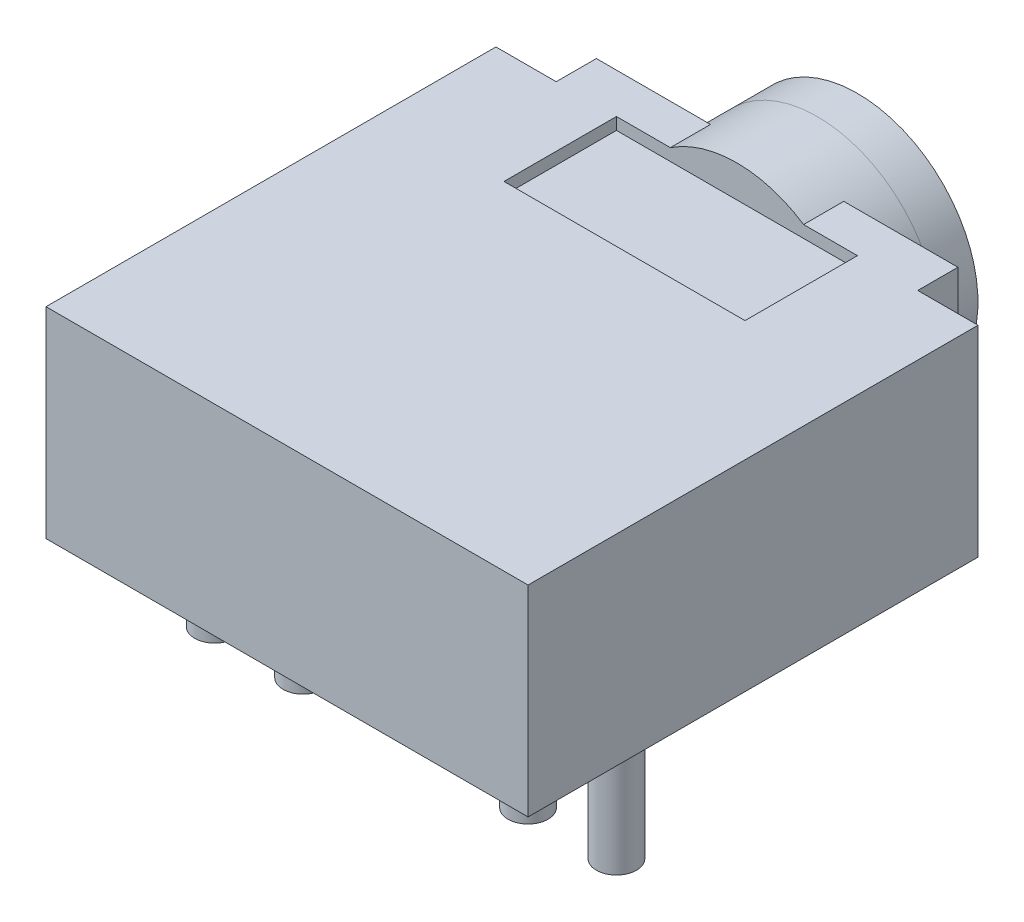
ISO-10303-21;
HEADER;
FILE_DESCRIPTION(('STEP AP214'),'2;1');
FILE_NAME('part.step','',(''),(''),'','','');
FILE_SCHEMA(('AUTOMOTIVE_DESIGN { 1 0 10303 214 1 1 1 1 }'));
ENDSEC;
DATA;
#1=APPLICATION_CONTEXT('core data for automotive mechanical design processes');
#2=APPLICATION_PROTOCOL_DEFINITION('international standard','automotive_design',2000,#1);
#3=PRODUCT_CONTEXT('',#1,'mechanical');
#4=PRODUCT('Part','Part','',(#3));
#5=PRODUCT_RELATED_PRODUCT_CATEGORY('part','',(#4));
#6=PRODUCT_DEFINITION_FORMATION('','',#4);
#7=PRODUCT_DEFINITION_CONTEXT('part definition',#1,'design');
#8=PRODUCT_DEFINITION('design','',#6,#7);
#9=PRODUCT_DEFINITION_SHAPE('','',#8);
#10=(LENGTH_UNIT() NAMED_UNIT(*) SI_UNIT(.MILLI.,.METRE.));
#11=(NAMED_UNIT(*) PLANE_ANGLE_UNIT() SI_UNIT($,.RADIAN.));
#12=(NAMED_UNIT(*) SI_UNIT($,.STERADIAN.) SOLID_ANGLE_UNIT());
#13=UNCERTAINTY_MEASURE_WITH_UNIT(LENGTH_MEASURE(1.E-05),#10,'distance_accuracy_value','');
#14=(GEOMETRIC_REPRESENTATION_CONTEXT(3) GLOBAL_UNCERTAINTY_ASSIGNED_CONTEXT((#13)) GLOBAL_UNIT_ASSIGNED_CONTEXT((#10,
#11,#12)) REPRESENTATION_CONTEXT('',''));
#15=CARTESIAN_POINT('',(0.,0.,0.));
#16=DIRECTION('',(0.,0.,1.));
#17=DIRECTION('',(1.,0.,0.));
#18=AXIS2_PLACEMENT_3D('',#15,#16,#17);
#19=CARTESIAN_POINT('',(-4.5,0.,-11.2));
#20=DIRECTION('',(0.,-1.,0.));
#21=DIRECTION('',(0.,0.,-1.));
#22=AXIS2_PLACEMENT_3D('',#19,#20,#21);
#23=PLANE('',#22);
#24=CARTESIAN_POINT('',(5.,0.,-3.2));
#25=DIRECTION('',(0.,-1.,0.));
#26=DIRECTION('',(0.,0.,1.));
#27=AXIS2_PLACEMENT_3D('',#24,#25,#26);
#28=CIRCLE('',#27,0.500000000000001);
#29=CARTESIAN_POINT('',(5.,0.,-2.7));
#30=VERTEX_POINT('',#29);
#31=EDGE_CURVE('E639',#30,#30,#28,.T.);
#32=ORIENTED_EDGE('',*,*,#31,.F.);
#33=EDGE_LOOP('',(#32));
#34=FACE_BOUND('',#33,.T.);
#35=CARTESIAN_POINT('',(-2.8,0.,-3.2));
#36=DIRECTION('',(0.,-1.,0.));
#37=DIRECTION('',(0.,0.,-1.));
#38=AXIS2_PLACEMENT_3D('',#35,#36,#37);
#39=CIRCLE('',#38,0.5);
#40=CARTESIAN_POINT('',(-2.8,0.,-3.7));
#41=VERTEX_POINT('',#40);
#42=EDGE_CURVE('E656',#41,#41,#39,.T.);
#43=ORIENTED_EDGE('',*,*,#42,.F.);
#44=EDGE_LOOP('',(#43));
#45=FACE_BOUND('',#44,.T.);
#46=DIRECTION('',(1.,0.,0.));
#47=VECTOR('',#46,1.);
#48=CARTESIAN_POINT('',(-4.5,0.,-11.2));
#49=LINE('',#48,#47);
#50=CARTESIAN_POINT('',(-1.6583123951777,0.,-11.2));
#51=VERTEX_POINT('',#50);
#52=CARTESIAN_POINT('',(1.6583123951777,0.,-11.2));
#53=VERTEX_POINT('',#52);
#54=EDGE_CURVE('E260',#51,#53,#49,.T.);
#55=ORIENTED_EDGE('',*,*,#54,.T.);
#56=DIRECTION('',(0.,0.,1.));
#57=VECTOR('',#56,1.);
#58=CARTESIAN_POINT('',(1.6583123951777,0.,-13.2));
#59=LINE('',#58,#57);
#60=CARTESIAN_POINT('',(1.6583123951777,0.,-12.2));
#61=VERTEX_POINT('',#60);
#62=EDGE_CURVE('E159',#53,#61,#59,.F.);
#63=ORIENTED_EDGE('',*,*,#62,.T.);
#64=DIRECTION('',(-1.,0.,0.));
#65=VECTOR('',#64,1.);
#66=CARTESIAN_POINT('',(4.5,0.,-12.2));
#67=LINE('',#66,#65);
#68=CARTESIAN_POINT('',(4.5,0.,-12.2));
#69=VERTEX_POINT('',#68);
#70=EDGE_CURVE('E214',#69,#61,#67,.T.);
#71=ORIENTED_EDGE('',*,*,#70,.F.);
#72=DIRECTION('',(0.,0.,-1.));
#73=VECTOR('',#72,1.);
#74=CARTESIAN_POINT('',(4.5,0.,-12.2));
#75=LINE('',#74,#73);
#76=CARTESIAN_POINT('',(4.5,0.,-11.2));
#77=VERTEX_POINT('',#76);
#78=EDGE_CURVE('E211',#77,#69,#75,.T.);
#79=ORIENTED_EDGE('',*,*,#78,.F.);
#80=DIRECTION('',(-1.,0.,0.));
#81=VECTOR('',#80,1.);
#82=CARTESIAN_POINT('',(4.5,0.,-11.2));
#83=LINE('',#82,#81);
#84=CARTESIAN_POINT('',(6.,0.,-11.2));
#85=VERTEX_POINT('',#84);
#86=EDGE_CURVE('E209',#85,#77,#83,.T.);
#87=ORIENTED_EDGE('',*,*,#86,.F.);
#88=DIRECTION('',(0.,0.,-1.));
#89=VECTOR('',#88,1.);
#90=CARTESIAN_POINT('',(6.,0.,-11.2));
#91=LINE('',#90,#89);
#92=CARTESIAN_POINT('',(6.,0.,0.));
#93=VERTEX_POINT('',#92);
#94=EDGE_CURVE('E207',#93,#85,#91,.T.);
#95=ORIENTED_EDGE('',*,*,#94,.F.);
#96=DIRECTION('',(1.,0.,0.));
#97=VECTOR('',#96,1.);
#98=CARTESIAN_POINT('',(-6.,0.,0.));
#99=LINE('',#98,#97);
#100=CARTESIAN_POINT('',(-6.,0.,0.));
#101=VERTEX_POINT('',#100);
#102=EDGE_CURVE('E205',#101,#93,#99,.T.);
#103=ORIENTED_EDGE('',*,*,#102,.F.);
#104=DIRECTION('',(0.,0.,1.));
#105=VECTOR('',#104,1.);
#106=CARTESIAN_POINT('',(-6.,0.,-11.2));
#107=LINE('',#106,#105);
#108=CARTESIAN_POINT('',(-6.,0.,-11.2));
#109=VERTEX_POINT('',#108);
#110=EDGE_CURVE('E203',#109,#101,#107,.T.);
#111=ORIENTED_EDGE('',*,*,#110,.F.);
#112=DIRECTION('',(-1.,0.,0.));
#113=VECTOR('',#112,1.);
#114=CARTESIAN_POINT('',(-4.5,0.,-11.2));
#115=LINE('',#114,#113);
#116=CARTESIAN_POINT('',(-4.5,0.,-11.2));
#117=VERTEX_POINT('',#116);
#118=EDGE_CURVE('E201',#117,#109,#115,.T.);
#119=ORIENTED_EDGE('',*,*,#118,.F.);
#120=DIRECTION('',(0.,0.,1.));
#121=VECTOR('',#120,1.);
#122=CARTESIAN_POINT('',(-4.5,0.,-12.2));
#123=LINE('',#122,#121);
#124=CARTESIAN_POINT('',(-4.5,0.,-12.2));
#125=VERTEX_POINT('',#124);
#126=EDGE_CURVE('E193',#125,#117,#123,.T.);
#127=ORIENTED_EDGE('',*,*,#126,.F.);
#128=CARTESIAN_POINT('',(-1.6583123951777,0.,-12.2));
#129=VERTEX_POINT('',#128);
#130=EDGE_CURVE('E213',#129,#125,#67,.T.);
#131=ORIENTED_EDGE('',*,*,#130,.F.);
#132=DIRECTION('',(0.,0.,1.));
#133=VECTOR('',#132,1.);
#134=CARTESIAN_POINT('',(-1.6583123951777,0.,-13.2));
#135=LINE('',#134,#133);
#136=EDGE_CURVE('E262',#129,#51,#135,.T.);
#137=ORIENTED_EDGE('',*,*,#136,.T.);
#138=EDGE_LOOP('',(#55,#63,#71,#79,#87,#95,#103,#111,#119,#127,#131,#137));
#139=FACE_BOUND('',#138,.T.);
#140=CARTESIAN_POINT('',(-5.,0.,-3.2));
#141=DIRECTION('',(0.,-1.,0.));
#142=DIRECTION('',(0.,0.,-1.));
#143=AXIS2_PLACEMENT_3D('',#140,#141,#142);
#144=CIRCLE('',#143,0.500000000000001);
#145=CARTESIAN_POINT('',(-5.,0.,-3.7));
#146=VERTEX_POINT('',#145);
#147=EDGE_CURVE('E662',#146,#146,#144,.T.);
#148=ORIENTED_EDGE('',*,*,#147,.F.);
#149=EDGE_LOOP('',(#148));
#150=FACE_BOUND('',#149,.T.);
#151=CARTESIAN_POINT('',(0.,0.,-8.4));
#152=DIRECTION('',(0.,-1.,0.));
#153=DIRECTION('',(0.,0.,-1.));
#154=AXIS2_PLACEMENT_3D('',#151,#152,#153);
#155=CIRCLE('',#154,0.5);
#156=CARTESIAN_POINT('',(0.,0.,-8.9));
#157=VERTEX_POINT('',#156);
#158=EDGE_CURVE('E650',#157,#157,#155,.T.);
#159=ORIENTED_EDGE('',*,*,#158,.F.);
#160=EDGE_LOOP('',(#159));
#161=FACE_BOUND('',#160,.T.);
#162=CARTESIAN_POINT('',(2.8,0.,-3.2));
#163=DIRECTION('',(0.,-1.,0.));
#164=DIRECTION('',(0.,0.,1.));
#165=AXIS2_PLACEMENT_3D('',#162,#163,#164);
#166=CIRCLE('',#165,0.5);
#167=CARTESIAN_POINT('',(2.8,0.,-2.7));
#168=VERTEX_POINT('',#167);
#169=EDGE_CURVE('E640',#168,#168,#166,.T.);
#170=ORIENTED_EDGE('',*,*,#169,.F.);
#171=EDGE_LOOP('',(#170));
#172=FACE_BOUND('',#171,.T.);
#173=ADVANCED_FACE('F32',(#34,#45,#139,#150,#161,#172),#23,.T.);
#174=CARTESIAN_POINT('',(4.5,5.,-12.2));
#175=DIRECTION('',(0.,0.,1.));
#176=DIRECTION('',(1.,0.,0.));
#177=AXIS2_PLACEMENT_3D('',#174,#175,#176);
#178=PLANE('',#177);
#179=CARTESIAN_POINT('',(0.,2.5,-12.2));
#180=DIRECTION('',(0.,0.,1.));
#181=DIRECTION('',(1.,0.,0.));
#182=AXIS2_PLACEMENT_3D('',#179,#180,#181);
#183=CIRCLE('',#182,3.);
#184=CARTESIAN_POINT('',(-1.6583123951777,5.,-12.2));
#185=VERTEX_POINT('',#184);
#186=EDGE_CURVE('E155',#129,#185,#183,.F.);
#187=ORIENTED_EDGE('',*,*,#186,.F.);
#188=ORIENTED_EDGE('',*,*,#130,.T.);
#189=DIRECTION('',(0.,-1.,0.));
#190=VECTOR('',#189,1.);
#191=CARTESIAN_POINT('',(-4.5,5.,-12.2));
#192=LINE('',#191,#190);
#193=CARTESIAN_POINT('',(-4.5,5.,-12.2));
#194=VERTEX_POINT('',#193);
#195=EDGE_CURVE('E236',#194,#125,#192,.T.);
#196=ORIENTED_EDGE('',*,*,#195,.F.);
#197=DIRECTION('',(-1.,0.,0.));
#198=VECTOR('',#197,1.);
#199=CARTESIAN_POINT('',(4.5,5.,-12.2));
#200=LINE('',#199,#198);
#201=EDGE_CURVE('E232',#185,#194,#200,.T.);
#202=ORIENTED_EDGE('',*,*,#201,.F.);
#203=EDGE_LOOP('',(#187,#188,#196,#202));
#204=FACE_BOUND('',#203,.T.);
#205=ADVANCED_FACE('F302',(#204),#178,.F.);
#206=CARTESIAN_POINT('',(1.6583123951777,5.,-12.2));
#207=VERTEX_POINT('',#206);
#208=EDGE_CURVE('E270',#207,#61,#183,.F.);
#209=ORIENTED_EDGE('',*,*,#208,.F.);
#210=CARTESIAN_POINT('',(4.5,5.,-12.2));
#211=VERTEX_POINT('',#210);
#212=EDGE_CURVE('E233',#211,#207,#200,.T.);
#213=ORIENTED_EDGE('',*,*,#212,.F.);
#214=DIRECTION('',(0.,-1.,0.));
#215=VECTOR('',#214,1.);
#216=CARTESIAN_POINT('',(4.5,5.,-12.2));
#217=LINE('',#216,#215);
#218=EDGE_CURVE('E239',#211,#69,#217,.T.);
#219=ORIENTED_EDGE('',*,*,#218,.T.);
#220=ORIENTED_EDGE('',*,*,#70,.T.);
#221=EDGE_LOOP('',(#209,#213,#219,#220));
#222=FACE_BOUND('',#221,.T.);
#223=ADVANCED_FACE('F307',(#222),#178,.F.);
#224=CARTESIAN_POINT('',(-4.5,5.,-11.2));
#225=DIRECTION('',(0.,-1.,0.));
#226=DIRECTION('',(0.,0.,-1.));
#227=AXIS2_PLACEMENT_3D('',#224,#225,#226);
#228=PLANE('',#227);
#229=DIRECTION('',(0.,0.,1.));
#230=VECTOR('',#229,1.);
#231=CARTESIAN_POINT('',(1.6583123951777,5.,-13.2));
#232=LINE('',#231,#230);
#233=CARTESIAN_POINT('',(1.6583123951777,5.,-11.2));
#234=VERTEX_POINT('',#233);
#235=EDGE_CURVE('E273',#234,#207,#232,.F.);
#236=ORIENTED_EDGE('',*,*,#235,.F.);
#237=DIRECTION('',(-1.,0.,0.));
#238=VECTOR('',#237,1.);
#239=CARTESIAN_POINT('',(-3.,5.,-11.2));
#240=LINE('',#239,#238);
#241=CARTESIAN_POINT('',(3.,5.,-11.2));
#242=VERTEX_POINT('',#241);
#243=EDGE_CURVE('E167',#242,#234,#240,.T.);
#244=ORIENTED_EDGE('',*,*,#243,.F.);
#245=DIRECTION('',(0.,0.,-1.));
#246=VECTOR('',#245,1.);
#247=CARTESIAN_POINT('',(3.,5.,-11.2));
#248=LINE('',#247,#246);
#249=CARTESIAN_POINT('',(3.,5.,-8.4));
#250=VERTEX_POINT('',#249);
#251=EDGE_CURVE('E172',#250,#242,#248,.T.);
#252=ORIENTED_EDGE('',*,*,#251,.F.);
#253=DIRECTION('',(1.,0.,0.));
#254=VECTOR('',#253,1.);
#255=CARTESIAN_POINT('',(-3.,5.,-8.4));
#256=LINE('',#255,#254);
#257=CARTESIAN_POINT('',(-3.,5.,-8.4));
#258=VERTEX_POINT('',#257);
#259=EDGE_CURVE('E176',#258,#250,#256,.T.);
#260=ORIENTED_EDGE('',*,*,#259,.F.);
#261=DIRECTION('',(0.,0.,1.));
#262=VECTOR('',#261,1.);
#263=CARTESIAN_POINT('',(-3.,5.,-11.2));
#264=LINE('',#263,#262);
#265=CARTESIAN_POINT('',(-3.,5.,-11.2));
#266=VERTEX_POINT('',#265);
#267=EDGE_CURVE('E58',#266,#258,#264,.T.);
#268=ORIENTED_EDGE('',*,*,#267,.F.);
#269=CARTESIAN_POINT('',(-1.6583123951777,5.,-11.2));
#270=VERTEX_POINT('',#269);
#271=EDGE_CURVE('E165',#270,#266,#240,.T.);
#272=ORIENTED_EDGE('',*,*,#271,.F.);
#273=DIRECTION('',(0.,0.,1.));
#274=VECTOR('',#273,1.);
#275=CARTESIAN_POINT('',(-1.6583123951777,5.,-13.2));
#276=LINE('',#275,#274);
#277=EDGE_CURVE('E149',#185,#270,#276,.T.);
#278=ORIENTED_EDGE('',*,*,#277,.F.);
#279=ORIENTED_EDGE('',*,*,#201,.T.);
#280=DIRECTION('',(0.,0.,1.));
#281=VECTOR('',#280,1.);
#282=CARTESIAN_POINT('',(-4.5,5.,-12.2));
#283=LINE('',#282,#281);
#284=CARTESIAN_POINT('',(-4.5,5.,-11.2));
#285=VERTEX_POINT('',#284);
#286=EDGE_CURVE('E217',#194,#285,#283,.T.);
#287=ORIENTED_EDGE('',*,*,#286,.T.);
#288=DIRECTION('',(-1.,0.,0.));
#289=VECTOR('',#288,1.);
#290=CARTESIAN_POINT('',(-4.5,5.,-11.2));
#291=LINE('',#290,#289);
#292=CARTESIAN_POINT('',(-6.,5.,-11.2));
#293=VERTEX_POINT('',#292);
#294=EDGE_CURVE('E220',#285,#293,#291,.T.);
#295=ORIENTED_EDGE('',*,*,#294,.T.);
#296=DIRECTION('',(0.,0.,1.));
#297=VECTOR('',#296,1.);
#298=CARTESIAN_POINT('',(-6.,5.,-11.2));
#299=LINE('',#298,#297);
#300=CARTESIAN_POINT('',(-6.,5.,0.));
#301=VERTEX_POINT('',#300);
#302=EDGE_CURVE('E222',#293,#301,#299,.T.);
#303=ORIENTED_EDGE('',*,*,#302,.T.);
#304=DIRECTION('',(1.,0.,0.));
#305=VECTOR('',#304,1.);
#306=CARTESIAN_POINT('',(-6.,5.,0.));
#307=LINE('',#306,#305);
#308=CARTESIAN_POINT('',(6.,5.,0.));
#309=VERTEX_POINT('',#308);
#310=EDGE_CURVE('E224',#301,#309,#307,.T.);
#311=ORIENTED_EDGE('',*,*,#310,.T.);
#312=DIRECTION('',(0.,0.,-1.));
#313=VECTOR('',#312,1.);
#314=CARTESIAN_POINT('',(6.,5.,-11.2));
#315=LINE('',#314,#313);
#316=CARTESIAN_POINT('',(6.,5.,-11.2));
#317=VERTEX_POINT('',#316);
#318=EDGE_CURVE('E226',#309,#317,#315,.T.);
#319=ORIENTED_EDGE('',*,*,#318,.T.);
#320=DIRECTION('',(-1.,0.,0.));
#321=VECTOR('',#320,1.);
#322=CARTESIAN_POINT('',(4.5,5.,-11.2));
#323=LINE('',#322,#321);
#324=CARTESIAN_POINT('',(4.5,5.,-11.2));
#325=VERTEX_POINT('',#324);
#326=EDGE_CURVE('E228',#317,#325,#323,.T.);
#327=ORIENTED_EDGE('',*,*,#326,.T.);
#328=DIRECTION('',(0.,0.,-1.));
#329=VECTOR('',#328,1.);
#330=CARTESIAN_POINT('',(4.5,5.,-12.2));
#331=LINE('',#330,#329);
#332=EDGE_CURVE('E230',#325,#211,#331,.T.);
#333=ORIENTED_EDGE('',*,*,#332,.T.);
#334=ORIENTED_EDGE('',*,*,#212,.T.);
#335=EDGE_LOOP('',(#236,#244,#252,#260,#268,#272,#278,#279,#287,#295,#303,#311,#319,#327,#333,#334));
#336=FACE_BOUND('',#335,.T.);
#337=ADVANCED_FACE('F170',(#336),#228,.F.);
#338=CARTESIAN_POINT('',(-4.5,5.,-12.2));
#339=DIRECTION('',(1.,0.,0.));
#340=DIRECTION('',(0.,0.,-1.));
#341=AXIS2_PLACEMENT_3D('',#338,#339,#340);
#342=PLANE('',#341);
#343=ORIENTED_EDGE('',*,*,#126,.T.);
#344=DIRECTION('',(0.,-1.,0.));
#345=VECTOR('',#344,1.);
#346=CARTESIAN_POINT('',(-4.5,5.,-11.2));
#347=LINE('',#346,#345);
#348=EDGE_CURVE('E11',#285,#117,#347,.T.);
#349=ORIENTED_EDGE('',*,*,#348,.F.);
#350=ORIENTED_EDGE('',*,*,#286,.F.);
#351=ORIENTED_EDGE('',*,*,#195,.T.);
#352=EDGE_LOOP('',(#343,#349,#350,#351));
#353=FACE_BOUND('',#352,.T.);
#354=ADVANCED_FACE('F34',(#353),#342,.F.);
#355=CARTESIAN_POINT('',(-4.5,5.,-11.2));
#356=DIRECTION('',(0.,0.,1.));
#357=DIRECTION('',(1.,0.,0.));
#358=AXIS2_PLACEMENT_3D('',#355,#356,#357);
#359=PLANE('',#358);
#360=ORIENTED_EDGE('',*,*,#118,.T.);
#361=DIRECTION('',(0.,-1.,0.));
#362=VECTOR('',#361,1.);
#363=CARTESIAN_POINT('',(-6.,5.,-11.2));
#364=LINE('',#363,#362);
#365=EDGE_CURVE('E43',#293,#109,#364,.T.);
#366=ORIENTED_EDGE('',*,*,#365,.F.);
#367=ORIENTED_EDGE('',*,*,#294,.F.);
#368=ORIENTED_EDGE('',*,*,#348,.T.);
#369=EDGE_LOOP('',(#360,#366,#367,#368));
#370=FACE_BOUND('',#369,.T.);
#371=ADVANCED_FACE('F328',(#370),#359,.F.);
#372=CARTESIAN_POINT('',(-6.,5.,-11.2));
#373=DIRECTION('',(1.,0.,0.));
#374=DIRECTION('',(0.,0.,-1.));
#375=AXIS2_PLACEMENT_3D('',#372,#373,#374);
#376=PLANE('',#375);
#377=ORIENTED_EDGE('',*,*,#110,.T.);
#378=DIRECTION('',(0.,-1.,0.));
#379=VECTOR('',#378,1.);
#380=CARTESIAN_POINT('',(-6.,5.,0.));
#381=LINE('',#380,#379);
#382=EDGE_CURVE('E251',#301,#101,#381,.T.);
#383=ORIENTED_EDGE('',*,*,#382,.F.);
#384=ORIENTED_EDGE('',*,*,#302,.F.);
#385=ORIENTED_EDGE('',*,*,#365,.T.);
#386=EDGE_LOOP('',(#377,#383,#384,#385));
#387=FACE_BOUND('',#386,.T.);
#388=ADVANCED_FACE('F325',(#387),#376,.F.);
#389=CARTESIAN_POINT('',(-6.,5.,0.));
#390=DIRECTION('',(0.,0.,-1.));
#391=DIRECTION('',(-1.,0.,0.));
#392=AXIS2_PLACEMENT_3D('',#389,#390,#391);
#393=PLANE('',#392);
#394=ORIENTED_EDGE('',*,*,#102,.T.);
#395=DIRECTION('',(0.,-1.,0.));
#396=VECTOR('',#395,1.);
#397=CARTESIAN_POINT('',(6.,5.,0.));
#398=LINE('',#397,#396);
#399=EDGE_CURVE('E248',#309,#93,#398,.T.);
#400=ORIENTED_EDGE('',*,*,#399,.F.);
#401=ORIENTED_EDGE('',*,*,#310,.F.);
#402=ORIENTED_EDGE('',*,*,#382,.T.);
#403=EDGE_LOOP('',(#394,#400,#401,#402));
#404=FACE_BOUND('',#403,.T.);
#405=ADVANCED_FACE('F321',(#404),#393,.F.);
#406=CARTESIAN_POINT('',(6.,5.,-11.2));
#407=DIRECTION('',(-1.,0.,0.));
#408=DIRECTION('',(0.,0.,1.));
#409=AXIS2_PLACEMENT_3D('',#406,#407,#408);
#410=PLANE('',#409);
#411=ORIENTED_EDGE('',*,*,#94,.T.);
#412=DIRECTION('',(0.,-1.,0.));
#413=VECTOR('',#412,1.);
#414=CARTESIAN_POINT('',(6.,5.,-11.2));
#415=LINE('',#414,#413);
#416=EDGE_CURVE('E245',#317,#85,#415,.T.);
#417=ORIENTED_EDGE('',*,*,#416,.F.);
#418=ORIENTED_EDGE('',*,*,#318,.F.);
#419=ORIENTED_EDGE('',*,*,#399,.T.);
#420=EDGE_LOOP('',(#411,#417,#418,#419));
#421=FACE_BOUND('',#420,.T.);
#422=ADVANCED_FACE('F317',(#421),#410,.F.);
#423=CARTESIAN_POINT('',(4.5,5.,-11.2));
#424=DIRECTION('',(0.,0.,1.));
#425=DIRECTION('',(1.,0.,0.));
#426=AXIS2_PLACEMENT_3D('',#423,#424,#425);
#427=PLANE('',#426);
#428=ORIENTED_EDGE('',*,*,#86,.T.);
#429=DIRECTION('',(0.,-1.,0.));
#430=VECTOR('',#429,1.);
#431=CARTESIAN_POINT('',(4.5,5.,-11.2));
#432=LINE('',#431,#430);
#433=EDGE_CURVE('E242',#325,#77,#432,.T.);
#434=ORIENTED_EDGE('',*,*,#433,.F.);
#435=ORIENTED_EDGE('',*,*,#326,.F.);
#436=ORIENTED_EDGE('',*,*,#416,.T.);
#437=EDGE_LOOP('',(#428,#434,#435,#436));
#438=FACE_BOUND('',#437,.T.);
#439=ADVANCED_FACE('F296',(#438),#427,.F.);
#440=CARTESIAN_POINT('',(4.5,5.,-12.2));
#441=DIRECTION('',(-1.,0.,0.));
#442=DIRECTION('',(0.,0.,1.));
#443=AXIS2_PLACEMENT_3D('',#440,#441,#442);
#444=PLANE('',#443);
#445=ORIENTED_EDGE('',*,*,#78,.T.);
#446=ORIENTED_EDGE('',*,*,#218,.F.);
#447=ORIENTED_EDGE('',*,*,#332,.F.);
#448=ORIENTED_EDGE('',*,*,#433,.T.);
#449=EDGE_LOOP('',(#445,#446,#447,#448));
#450=FACE_BOUND('',#449,.T.);
#451=ADVANCED_FACE('F289',(#450),#444,.F.);
#452=CARTESIAN_POINT('',(-3.,4.7,-11.2));
#453=DIRECTION('',(-1.,0.,0.));
#454=DIRECTION('',(0.,0.,1.));
#455=AXIS2_PLACEMENT_3D('',#452,#453,#454);
#456=PLANE('',#455);
#457=ORIENTED_EDGE('',*,*,#267,.T.);
#458=DIRECTION('',(0.,1.,0.));
#459=VECTOR('',#458,1.);
#460=CARTESIAN_POINT('',(-3.,4.7,-8.4));
#461=LINE('',#460,#459);
#462=CARTESIAN_POINT('',(-3.,4.7,-8.4));
#463=VERTEX_POINT('',#462);
#464=EDGE_CURVE('E190',#463,#258,#461,.T.);
#465=ORIENTED_EDGE('',*,*,#464,.F.);
#466=DIRECTION('',(0.,0.,1.));
#467=VECTOR('',#466,1.);
#468=CARTESIAN_POINT('',(-3.,4.7,-11.2));
#469=LINE('',#468,#467);
#470=CARTESIAN_POINT('',(-3.,4.7,-11.2));
#471=VERTEX_POINT('',#470);
#472=EDGE_CURVE('E174',#471,#463,#469,.T.);
#473=ORIENTED_EDGE('',*,*,#472,.F.);
#474=DIRECTION('',(0.,1.,0.));
#475=VECTOR('',#474,1.);
#476=CARTESIAN_POINT('',(-3.,4.7,-11.2));
#477=LINE('',#476,#475);
#478=EDGE_CURVE('E191',#471,#266,#477,.T.);
#479=ORIENTED_EDGE('',*,*,#478,.T.);
#480=EDGE_LOOP('',(#457,#465,#473,#479));
#481=FACE_BOUND('',#480,.T.);
#482=ADVANCED_FACE('F287',(#481),#456,.F.);
#483=CARTESIAN_POINT('',(-3.,4.7,-11.2));
#484=DIRECTION('',(0.,0.,-1.));
#485=DIRECTION('',(-1.,0.,0.));
#486=AXIS2_PLACEMENT_3D('',#483,#484,#485);
#487=PLANE('',#486);
#488=ORIENTED_EDGE('',*,*,#478,.F.);
#489=DIRECTION('',(-1.,0.,0.));
#490=VECTOR('',#489,1.);
#491=CARTESIAN_POINT('',(-3.,4.7,-11.2));
#492=LINE('',#491,#490);
#493=CARTESIAN_POINT('',(3.,4.7,-11.2));
#494=VERTEX_POINT('',#493);
#495=EDGE_CURVE('E188',#494,#471,#492,.T.);
#496=ORIENTED_EDGE('',*,*,#495,.F.);
#497=DIRECTION('',(0.,1.,0.));
#498=VECTOR('',#497,1.);
#499=CARTESIAN_POINT('',(3.,4.7,-11.2));
#500=LINE('',#499,#498);
#501=EDGE_CURVE('E194',#494,#242,#500,.T.);
#502=ORIENTED_EDGE('',*,*,#501,.T.);
#503=ORIENTED_EDGE('',*,*,#243,.T.);
#504=CARTESIAN_POINT('',(0.,2.5,-11.2));
#505=DIRECTION('',(0.,0.,-1.));
#506=DIRECTION('',(-1.,0.,0.));
#507=AXIS2_PLACEMENT_3D('',#504,#505,#506);
#508=CIRCLE('',#507,3.);
#509=EDGE_CURVE('E152',#270,#234,#508,.T.);
#510=ORIENTED_EDGE('',*,*,#509,.F.);
#511=ORIENTED_EDGE('',*,*,#271,.T.);
#512=EDGE_LOOP('',(#488,#496,#502,#503,#510,#511));
#513=FACE_BOUND('',#512,.T.);
#514=ADVANCED_FACE('F164',(#513),#487,.F.);
#515=CARTESIAN_POINT('',(3.,4.7,-11.2));
#516=DIRECTION('',(1.,0.,0.));
#517=DIRECTION('',(0.,0.,-1.));
#518=AXIS2_PLACEMENT_3D('',#515,#516,#517);
#519=PLANE('',#518);
#520=ORIENTED_EDGE('',*,*,#251,.T.);
#521=ORIENTED_EDGE('',*,*,#501,.F.);
#522=DIRECTION('',(0.,0.,-1.));
#523=VECTOR('',#522,1.);
#524=CARTESIAN_POINT('',(3.,4.7,-11.2));
#525=LINE('',#524,#523);
#526=CARTESIAN_POINT('',(3.,4.7,-8.4));
#527=VERTEX_POINT('',#526);
#528=EDGE_CURVE('E185',#527,#494,#525,.T.);
#529=ORIENTED_EDGE('',*,*,#528,.F.);
#530=DIRECTION('',(0.,1.,0.));
#531=VECTOR('',#530,1.);
#532=CARTESIAN_POINT('',(3.,4.7,-8.4));
#533=LINE('',#532,#531);
#534=EDGE_CURVE('E196',#527,#250,#533,.T.);
#535=ORIENTED_EDGE('',*,*,#534,.T.);
#536=EDGE_LOOP('',(#520,#521,#529,#535));
#537=FACE_BOUND('',#536,.T.);
#538=ADVANCED_FACE('F282',(#537),#519,.F.);
#539=CARTESIAN_POINT('',(-3.,4.7,-8.4));
#540=DIRECTION('',(0.,0.,1.));
#541=DIRECTION('',(1.,0.,0.));
#542=AXIS2_PLACEMENT_3D('',#539,#540,#541);
#543=PLANE('',#542);
#544=ORIENTED_EDGE('',*,*,#259,.T.);
#545=ORIENTED_EDGE('',*,*,#534,.F.);
#546=DIRECTION('',(1.,0.,0.));
#547=VECTOR('',#546,1.);
#548=CARTESIAN_POINT('',(-3.,4.7,-8.4));
#549=LINE('',#548,#547);
#550=EDGE_CURVE('E182',#463,#527,#549,.T.);
#551=ORIENTED_EDGE('',*,*,#550,.F.);
#552=ORIENTED_EDGE('',*,*,#464,.T.);
#553=EDGE_LOOP('',(#544,#545,#551,#552));
#554=FACE_BOUND('',#553,.T.);
#555=ADVANCED_FACE('F278',(#554),#543,.F.);
#556=CARTESIAN_POINT('',(-3.,4.7,-8.4));
#557=DIRECTION('',(0.,1.,0.));
#558=DIRECTION('',(0.,0.,1.));
#559=AXIS2_PLACEMENT_3D('',#556,#557,#558);
#560=PLANE('',#559);
#561=ORIENTED_EDGE('',*,*,#472,.T.);
#562=ORIENTED_EDGE('',*,*,#550,.T.);
#563=ORIENTED_EDGE('',*,*,#528,.T.);
#564=ORIENTED_EDGE('',*,*,#495,.T.);
#565=EDGE_LOOP('',(#561,#562,#563,#564));
#566=FACE_BOUND('',#565,.T.);
#567=ADVANCED_FACE('F285',(#566),#560,.T.);
#568=CARTESIAN_POINT('',(0.,2.5,-13.2));
#569=DIRECTION('',(0.,0.,1.));
#570=DIRECTION('',(1.,0.,0.));
#571=AXIS2_PLACEMENT_3D('',#568,#569,#570);
#572=CYLINDRICAL_SURFACE('',#571,3.);
#573=CARTESIAN_POINT('',(0.,2.5,-13.2));
#574=DIRECTION('',(0.,0.,-1.));
#575=DIRECTION('',(-1.,0.,0.));
#576=AXIS2_PLACEMENT_3D('',#573,#574,#575);
#577=CIRCLE('',#576,2.999);
#578=CARTESIAN_POINT('',(-2.999,2.5,-13.2));
#579=VERTEX_POINT('',#578);
#580=EDGE_CURVE('E168',#579,#579,#577,.T.);
#581=ORIENTED_EDGE('',*,*,#580,.F.);
#582=EDGE_LOOP('',(#581));
#583=FACE_BOUND('',#582,.T.);
#584=ORIENTED_EDGE('',*,*,#509,.T.);
#585=ORIENTED_EDGE('',*,*,#235,.T.);
#586=ORIENTED_EDGE('',*,*,#208,.T.);
#587=ORIENTED_EDGE('',*,*,#62,.F.);
#588=EDGE_CURVE('E50',#53,#51,#508,.T.);
#589=ORIENTED_EDGE('',*,*,#588,.T.);
#590=ORIENTED_EDGE('',*,*,#136,.F.);
#591=ORIENTED_EDGE('',*,*,#186,.T.);
#592=ORIENTED_EDGE('',*,*,#277,.T.);
#593=EDGE_LOOP('',(#584,#585,#586,#587,#589,#590,#591,#592));
#594=FACE_BOUND('',#593,.T.);
#595=ADVANCED_FACE('F151',(#583,#594),#572,.T.);
#596=CARTESIAN_POINT('',(0.,2.5,-11.2));
#597=DIRECTION('',(0.,0.,-1.));
#598=DIRECTION('',(-1.,0.,0.));
#599=AXIS2_PLACEMENT_3D('',#596,#597,#598);
#600=PLANE('',#599);
#601=ORIENTED_EDGE('',*,*,#54,.F.);
#602=ORIENTED_EDGE('',*,*,#588,.F.);
#603=EDGE_LOOP('',(#601,#602));
#604=FACE_BOUND('',#603,.T.);
#605=ADVANCED_FACE('F379',(#604),#600,.F.);
#606=CARTESIAN_POINT('',(0.,2.5,-14.2));
#607=DIRECTION('',(0.,0.,1.));
#608=DIRECTION('',(1.,0.,0.));
#609=AXIS2_PLACEMENT_3D('',#606,#607,#608);
#610=CYLINDRICAL_SURFACE('',#609,2.999);
#611=CARTESIAN_POINT('',(0.,2.5,-14.2));
#612=DIRECTION('',(0.,0.,-1.));
#613=DIRECTION('',(-1.,0.,0.));
#614=AXIS2_PLACEMENT_3D('',#611,#612,#613);
#615=CIRCLE('',#614,2.999);
#616=CARTESIAN_POINT('',(-2.999,2.5,-14.2));
#617=VERTEX_POINT('',#616);
#618=EDGE_CURVE('E355',#617,#617,#615,.T.);
#619=ORIENTED_EDGE('',*,*,#618,.F.);
#620=EDGE_LOOP('',(#619));
#621=FACE_BOUND('',#620,.T.);
#622=ORIENTED_EDGE('',*,*,#580,.T.);
#623=EDGE_LOOP('',(#622));
#624=FACE_BOUND('',#623,.T.);
#625=ADVANCED_FACE('F368',(#621,#624),#610,.T.);
#626=CARTESIAN_POINT('',(0.,2.5,-14.2));
#627=DIRECTION('',(0.,0.,-1.));
#628=DIRECTION('',(-1.,0.,0.));
#629=AXIS2_PLACEMENT_3D('',#626,#627,#628);
#630=PLANE('',#629);
#631=CARTESIAN_POINT('',(0.,2.5,-14.2));
#632=DIRECTION('',(0.,0.,-1.));
#633=DIRECTION('',(-1.,0.,0.));
#634=AXIS2_PLACEMENT_3D('',#631,#632,#633);
#635=CIRCLE('',#634,1.75);
#636=CARTESIAN_POINT('',(-1.75,2.5,-14.2));
#637=VERTEX_POINT('',#636);
#638=EDGE_CURVE('E362',#637,#637,#635,.T.);
#639=ORIENTED_EDGE('',*,*,#638,.F.);
#640=EDGE_LOOP('',(#639));
#641=FACE_BOUND('',#640,.T.);
#642=ORIENTED_EDGE('',*,*,#618,.T.);
#643=EDGE_LOOP('',(#642));
#644=FACE_BOUND('',#643,.T.);
#645=ADVANCED_FACE('F378',(#641,#644),#630,.T.);
#646=CARTESIAN_POINT('',(0.,2.5,-4.2));
#647=DIRECTION('',(0.,0.,-1.));
#648=DIRECTION('',(-1.,0.,0.));
#649=AXIS2_PLACEMENT_3D('',#646,#647,#648);
#650=CYLINDRICAL_SURFACE('',#649,1.75);
#651=CARTESIAN_POINT('',(0.,2.5,-4.2));
#652=DIRECTION('',(0.,0.,-1.));
#653=DIRECTION('',(-1.,0.,0.));
#654=AXIS2_PLACEMENT_3D('',#651,#652,#653);
#655=CIRCLE('',#654,1.75);
#656=CARTESIAN_POINT('',(-1.75,2.5,-4.2));
#657=VERTEX_POINT('',#656);
#658=EDGE_CURVE('E357',#657,#657,#655,.T.);
#659=ORIENTED_EDGE('',*,*,#658,.F.);
#660=EDGE_LOOP('',(#659));
#661=FACE_BOUND('',#660,.T.);
#662=ORIENTED_EDGE('',*,*,#638,.T.);
#663=EDGE_LOOP('',(#662));
#664=FACE_BOUND('',#663,.T.);
#665=ADVANCED_FACE('F418',(#661,#664),#650,.F.);
#666=CARTESIAN_POINT('',(0.,2.5,-4.2));
#667=DIRECTION('',(0.,0.,-1.));
#668=DIRECTION('',(-1.,0.,0.));
#669=AXIS2_PLACEMENT_3D('',#666,#667,#668);
#670=PLANE('',#669);
#671=ORIENTED_EDGE('',*,*,#658,.T.);
#672=EDGE_LOOP('',(#671));
#673=FACE_BOUND('',#672,.T.);
#674=ADVANCED_FACE('F425',(#673),#670,.T.);
#675=CARTESIAN_POINT('',(-5.,-3.,-3.2));
#676=DIRECTION('',(0.,1.,0.));
#677=DIRECTION('',(0.,0.,1.));
#678=AXIS2_PLACEMENT_3D('',#675,#676,#677);
#679=CYLINDRICAL_SURFACE('',#678,0.500000000000001);
#680=CARTESIAN_POINT('',(-5.,-3.,-3.2));
#681=DIRECTION('',(0.,-1.,0.));
#682=DIRECTION('',(0.,0.,-1.));
#683=AXIS2_PLACEMENT_3D('',#680,#681,#682);
#684=CIRCLE('',#683,0.500000000000001);
#685=CARTESIAN_POINT('',(-5.,-3.,-3.7));
#686=VERTEX_POINT('',#685);
#687=EDGE_CURVE('E665',#686,#686,#684,.T.);
#688=ORIENTED_EDGE('',*,*,#687,.F.);
#689=EDGE_LOOP('',(#688));
#690=FACE_BOUND('',#689,.T.);
#691=ORIENTED_EDGE('',*,*,#147,.T.);
#692=EDGE_LOOP('',(#691));
#693=FACE_BOUND('',#692,.T.);
#694=ADVANCED_FACE('F432',(#690,#693),#679,.T.);
#695=CARTESIAN_POINT('',(-5.,-3.,-3.2));
#696=DIRECTION('',(0.,-1.,0.));
#697=DIRECTION('',(0.,0.,-1.));
#698=AXIS2_PLACEMENT_3D('',#695,#696,#697);
#699=PLANE('',#698);
#700=ORIENTED_EDGE('',*,*,#687,.T.);
#701=EDGE_LOOP('',(#700));
#702=FACE_BOUND('',#701,.T.);
#703=ADVANCED_FACE('F440',(#702),#699,.T.);
#704=CARTESIAN_POINT('',(-2.8,-3.,-3.2));
#705=DIRECTION('',(0.,1.,0.));
#706=DIRECTION('',(0.,0.,1.));
#707=AXIS2_PLACEMENT_3D('',#704,#705,#706);
#708=CYLINDRICAL_SURFACE('',#707,0.5);
#709=CARTESIAN_POINT('',(-2.8,-3.,-3.2));
#710=DIRECTION('',(0.,-1.,0.));
#711=DIRECTION('',(0.,0.,-1.));
#712=AXIS2_PLACEMENT_3D('',#709,#710,#711);
#713=CIRCLE('',#712,0.5);
#714=CARTESIAN_POINT('',(-2.8,-3.,-3.7));
#715=VERTEX_POINT('',#714);
#716=EDGE_CURVE('E659',#715,#715,#713,.T.);
#717=ORIENTED_EDGE('',*,*,#716,.F.);
#718=EDGE_LOOP('',(#717));
#719=FACE_BOUND('',#718,.T.);
#720=ORIENTED_EDGE('',*,*,#42,.T.);
#721=EDGE_LOOP('',(#720));
#722=FACE_BOUND('',#721,.T.);
#723=ADVANCED_FACE('F448',(#719,#722),#708,.T.);
#724=CARTESIAN_POINT('',(-2.8,-3.,-3.2));
#725=DIRECTION('',(0.,-1.,0.));
#726=DIRECTION('',(0.,0.,-1.));
#727=AXIS2_PLACEMENT_3D('',#724,#725,#726);
#728=PLANE('',#727);
#729=ORIENTED_EDGE('',*,*,#716,.T.);
#730=EDGE_LOOP('',(#729));
#731=FACE_BOUND('',#730,.T.);
#732=ADVANCED_FACE('F456',(#731),#728,.T.);
#733=CARTESIAN_POINT('',(0.,-3.,-8.4));
#734=DIRECTION('',(0.,1.,0.));
#735=DIRECTION('',(0.,0.,1.));
#736=AXIS2_PLACEMENT_3D('',#733,#734,#735);
#737=CYLINDRICAL_SURFACE('',#736,0.5);
#738=CARTESIAN_POINT('',(0.,-3.,-8.4));
#739=DIRECTION('',(0.,-1.,0.));
#740=DIRECTION('',(0.,0.,-1.));
#741=AXIS2_PLACEMENT_3D('',#738,#739,#740);
#742=CIRCLE('',#741,0.5);
#743=CARTESIAN_POINT('',(0.,-3.,-8.9));
#744=VERTEX_POINT('',#743);
#745=EDGE_CURVE('E653',#744,#744,#742,.T.);
#746=ORIENTED_EDGE('',*,*,#745,.F.);
#747=EDGE_LOOP('',(#746));
#748=FACE_BOUND('',#747,.T.);
#749=ORIENTED_EDGE('',*,*,#158,.T.);
#750=EDGE_LOOP('',(#749));
#751=FACE_BOUND('',#750,.T.);
#752=ADVANCED_FACE('F464',(#748,#751),#737,.T.);
#753=CARTESIAN_POINT('',(0.,-3.,-8.4));
#754=DIRECTION('',(0.,-1.,0.));
#755=DIRECTION('',(0.,0.,-1.));
#756=AXIS2_PLACEMENT_3D('',#753,#754,#755);
#757=PLANE('',#756);
#758=ORIENTED_EDGE('',*,*,#745,.T.);
#759=EDGE_LOOP('',(#758));
#760=FACE_BOUND('',#759,.T.);
#761=ADVANCED_FACE('F472',(#760),#757,.T.);
#762=CARTESIAN_POINT('',(5.,-3.,-3.2));
#763=DIRECTION('',(0.,1.,0.));
#764=DIRECTION('',(0.,0.,1.));
#765=AXIS2_PLACEMENT_3D('',#762,#763,#764);
#766=CYLINDRICAL_SURFACE('',#765,0.500000000000001);
#767=CARTESIAN_POINT('',(5.,-3.,-3.2));
#768=DIRECTION('',(0.,-1.,0.));
#769=DIRECTION('',(0.,0.,1.));
#770=AXIS2_PLACEMENT_3D('',#767,#768,#769);
#771=CIRCLE('',#770,0.500000000000001);
#772=CARTESIAN_POINT('',(5.,-3.,-2.7));
#773=VERTEX_POINT('',#772);
#774=EDGE_CURVE('E643',#773,#773,#771,.T.);
#775=ORIENTED_EDGE('',*,*,#774,.F.);
#776=EDGE_LOOP('',(#775));
#777=FACE_BOUND('',#776,.T.);
#778=ORIENTED_EDGE('',*,*,#31,.T.);
#779=EDGE_LOOP('',(#778));
#780=FACE_BOUND('',#779,.T.);
#781=ADVANCED_FACE('F480',(#777,#780),#766,.T.);
#782=CARTESIAN_POINT('',(5.,-3.,-3.2));
#783=DIRECTION('',(0.,1.,0.));
#784=DIRECTION('',(0.,0.,1.));
#785=AXIS2_PLACEMENT_3D('',#782,#783,#784);
#786=PLANE('',#785);
#787=ORIENTED_EDGE('',*,*,#774,.T.);
#788=EDGE_LOOP('',(#787));
#789=FACE_BOUND('',#788,.T.);
#790=ADVANCED_FACE('F488',(#789),#786,.F.);
#791=CARTESIAN_POINT('',(2.8,-3.,-3.2));
#792=DIRECTION('',(0.,1.,0.));
#793=DIRECTION('',(0.,0.,1.));
#794=AXIS2_PLACEMENT_3D('',#791,#792,#793);
#795=CYLINDRICAL_SURFACE('',#794,0.5);
#796=CARTESIAN_POINT('',(2.8,-3.,-3.2));
#797=DIRECTION('',(0.,-1.,0.));
#798=DIRECTION('',(0.,0.,1.));
#799=AXIS2_PLACEMENT_3D('',#796,#797,#798);
#800=CIRCLE('',#799,0.5);
#801=CARTESIAN_POINT('',(2.8,-3.,-2.7));
#802=VERTEX_POINT('',#801);
#803=EDGE_CURVE('E638',#802,#802,#800,.T.);
#804=ORIENTED_EDGE('',*,*,#803,.F.);
#805=EDGE_LOOP('',(#804));
#806=FACE_BOUND('',#805,.T.);
#807=ORIENTED_EDGE('',*,*,#169,.T.);
#808=EDGE_LOOP('',(#807));
#809=FACE_BOUND('',#808,.T.);
#810=ADVANCED_FACE('F496',(#806,#809),#795,.T.);
#811=CARTESIAN_POINT('',(2.8,-3.,-3.2));
#812=DIRECTION('',(0.,1.,0.));
#813=DIRECTION('',(0.,0.,1.));
#814=AXIS2_PLACEMENT_3D('',#811,#812,#813);
#815=PLANE('',#814);
#816=ORIENTED_EDGE('',*,*,#803,.T.);
#817=EDGE_LOOP('',(#816));
#818=FACE_BOUND('',#817,.T.);
#819=ADVANCED_FACE('F504',(#818),#815,.F.);
#820=CLOSED_SHELL('',(#173,#205,#223,#337,#354,#371,#388,#405,#422,#439,#451,#482,#514,#538,
#555,#567,#595,#605,#625,#645,#665,#674,#694,#703,#723,#732,#752,#761,#781,#790,#810,#819));
#821=MANIFOLD_SOLID_BREP('B2',#820);
#822=ADVANCED_BREP_SHAPE_REPRESENTATION('',(#18,#821),#14);
#823=SHAPE_DEFINITION_REPRESENTATION(#9,#822);
ENDSEC;
END-ISO-10303-21;
